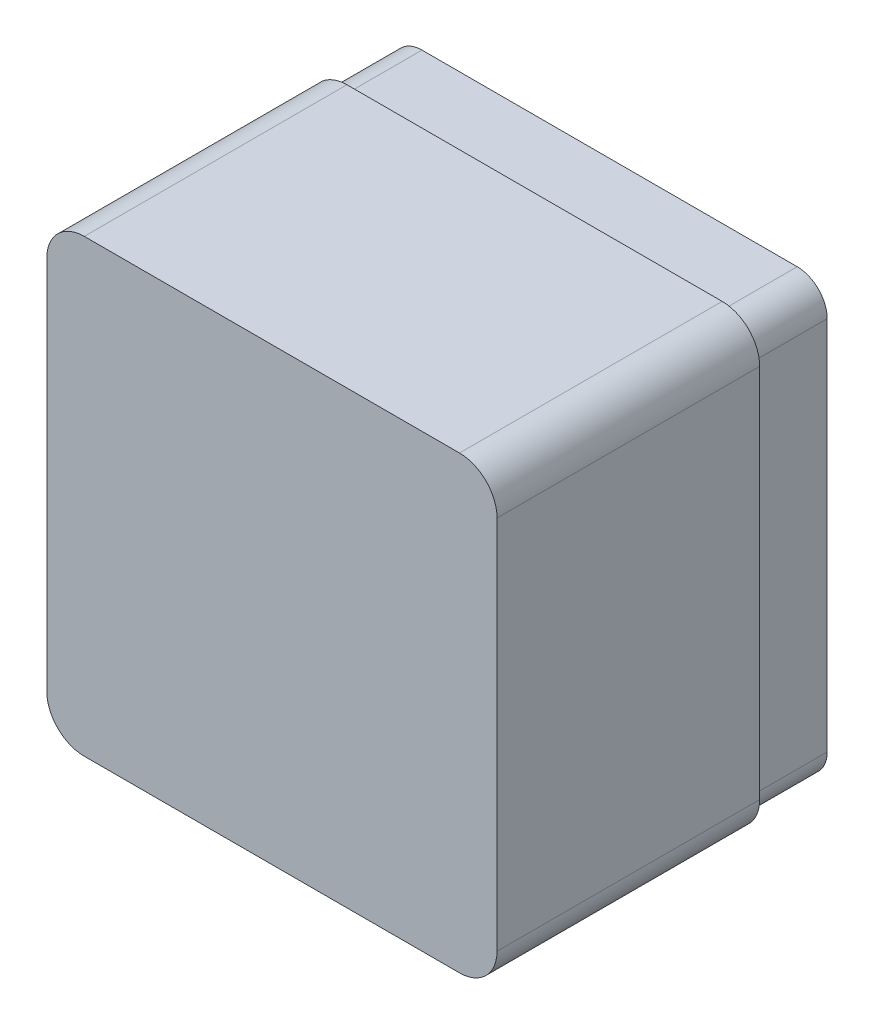
ISO-10303-21;
HEADER;
FILE_DESCRIPTION(('STEP AP214'),'2;1');
FILE_NAME('part.step','',(''),(''),'','','');
FILE_SCHEMA(('AUTOMOTIVE_DESIGN { 1 0 10303 214 1 1 1 1 }'));
ENDSEC;
DATA;
#1=APPLICATION_CONTEXT('core data for automotive mechanical design processes');
#2=APPLICATION_PROTOCOL_DEFINITION('international standard','automotive_design',2000,#1);
#3=PRODUCT_CONTEXT('',#1,'mechanical');
#4=PRODUCT('Part','Part','',(#3));
#5=PRODUCT_RELATED_PRODUCT_CATEGORY('part','',(#4));
#6=PRODUCT_DEFINITION_FORMATION('','',#4);
#7=PRODUCT_DEFINITION_CONTEXT('part definition',#1,'design');
#8=PRODUCT_DEFINITION('design','',#6,#7);
#9=PRODUCT_DEFINITION_SHAPE('','',#8);
#10=(LENGTH_UNIT() NAMED_UNIT(*) SI_UNIT(.MILLI.,.METRE.));
#11=(NAMED_UNIT(*) PLANE_ANGLE_UNIT() SI_UNIT($,.RADIAN.));
#12=(NAMED_UNIT(*) SI_UNIT($,.STERADIAN.) SOLID_ANGLE_UNIT());
#13=UNCERTAINTY_MEASURE_WITH_UNIT(LENGTH_MEASURE(1.E-05),#10,'distance_accuracy_value','');
#14=(GEOMETRIC_REPRESENTATION_CONTEXT(3) GLOBAL_UNCERTAINTY_ASSIGNED_CONTEXT((#13)) GLOBAL_UNIT_ASSIGNED_CONTEXT((#10,
#11,#12)) REPRESENTATION_CONTEXT('',''));
#15=CARTESIAN_POINT('',(0.,0.,0.));
#16=DIRECTION('',(0.,0.,1.));
#17=DIRECTION('',(1.,0.,0.));
#18=AXIS2_PLACEMENT_3D('',#15,#16,#17);
#19=CARTESIAN_POINT('',(0.,0.,0.));
#20=DIRECTION('',(0.,0.,1.));
#21=DIRECTION('',(1.,0.,0.));
#22=AXIS2_PLACEMENT_3D('',#19,#20,#21);
#23=PLANE('',#22);
#24=CARTESIAN_POINT('',(-50.,-50.,0.));
#25=DIRECTION('',(0.,0.,1.));
#26=DIRECTION('',(1.,0.,0.));
#27=AXIS2_PLACEMENT_3D('',#24,#25,#26);
#28=CIRCLE('',#27,6.);
#29=CARTESIAN_POINT('',(-50.,-56.,0.));
#30=VERTEX_POINT('',#29);
#31=CARTESIAN_POINT('',(-56.,-50.,0.));
#32=VERTEX_POINT('',#31);
#33=EDGE_CURVE('E335',#30,#32,#28,.F.);
#34=ORIENTED_EDGE('',*,*,#33,.F.);
#35=DIRECTION('',(1.,0.,0.));
#36=VECTOR('',#35,1.);
#37=CARTESIAN_POINT('',(-60.,-56.,0.));
#38=LINE('',#37,#36);
#39=CARTESIAN_POINT('',(50.,-56.,0.));
#40=VERTEX_POINT('',#39);
#41=EDGE_CURVE('E382',#30,#40,#38,.T.);
#42=ORIENTED_EDGE('',*,*,#41,.T.);
#43=CARTESIAN_POINT('',(50.,-50.,0.));
#44=DIRECTION('',(0.,0.,1.));
#45=DIRECTION('',(1.,0.,0.));
#46=AXIS2_PLACEMENT_3D('',#43,#44,#45);
#47=CIRCLE('',#46,6.);
#48=CARTESIAN_POINT('',(56.,-50.,0.));
#49=VERTEX_POINT('',#48);
#50=EDGE_CURVE('E392',#49,#40,#47,.F.);
#51=ORIENTED_EDGE('',*,*,#50,.F.);
#52=DIRECTION('',(0.,1.,0.));
#53=VECTOR('',#52,1.);
#54=CARTESIAN_POINT('',(56.,60.,0.));
#55=LINE('',#54,#53);
#56=CARTESIAN_POINT('',(56.,50.,0.));
#57=VERTEX_POINT('',#56);
#58=EDGE_CURVE('E389',#49,#57,#55,.T.);
#59=ORIENTED_EDGE('',*,*,#58,.T.);
#60=CARTESIAN_POINT('',(50.,50.,0.));
#61=DIRECTION('',(0.,0.,1.));
#62=DIRECTION('',(1.,0.,0.));
#63=AXIS2_PLACEMENT_3D('',#60,#61,#62);
#64=CIRCLE('',#63,6.);
#65=CARTESIAN_POINT('',(50.,56.,0.));
#66=VERTEX_POINT('',#65);
#67=EDGE_CURVE('E385',#66,#57,#64,.F.);
#68=ORIENTED_EDGE('',*,*,#67,.F.);
#69=DIRECTION('',(-1.,0.,0.));
#70=VECTOR('',#69,1.);
#71=CARTESIAN_POINT('',(-60.,56.,0.));
#72=LINE('',#71,#70);
#73=CARTESIAN_POINT('',(-50.,56.,0.));
#74=VERTEX_POINT('',#73);
#75=EDGE_CURVE('E332',#66,#74,#72,.T.);
#76=ORIENTED_EDGE('',*,*,#75,.T.);
#77=CARTESIAN_POINT('',(-50.,50.,0.));
#78=DIRECTION('',(0.,0.,1.));
#79=DIRECTION('',(1.,0.,0.));
#80=AXIS2_PLACEMENT_3D('',#77,#78,#79);
#81=CIRCLE('',#80,6.);
#82=CARTESIAN_POINT('',(-56.,50.,0.));
#83=VERTEX_POINT('',#82);
#84=EDGE_CURVE('E363',#83,#74,#81,.F.);
#85=ORIENTED_EDGE('',*,*,#84,.F.);
#86=DIRECTION('',(0.,-1.,0.));
#87=VECTOR('',#86,1.);
#88=CARTESIAN_POINT('',(-56.,60.,0.));
#89=LINE('',#88,#87);
#90=EDGE_CURVE('E321',#83,#32,#89,.T.);
#91=ORIENTED_EDGE('',*,*,#90,.T.);
#92=EDGE_LOOP('',(#34,#42,#51,#59,#68,#76,#85,#91));
#93=FACE_BOUND('',#92,.T.);
#94=CARTESIAN_POINT('',(-50.,50.,0.));
#95=DIRECTION('',(0.,0.,-1.));
#96=DIRECTION('',(-1.,0.,0.));
#97=AXIS2_PLACEMENT_3D('',#94,#95,#96);
#98=CIRCLE('',#97,7.99999999999999);
#99=CARTESIAN_POINT('',(-58.,50.,0.));
#100=VERTEX_POINT('',#99);
#101=CARTESIAN_POINT('',(-50.,58.,0.));
#102=VERTEX_POINT('',#101);
#103=EDGE_CURVE('E257',#100,#102,#98,.T.);
#104=ORIENTED_EDGE('',*,*,#103,.T.);
#105=DIRECTION('',(1.,0.,0.));
#106=VECTOR('',#105,1.);
#107=CARTESIAN_POINT('',(-50.,58.,0.));
#108=LINE('',#107,#106);
#109=CARTESIAN_POINT('',(50.,58.,0.));
#110=VERTEX_POINT('',#109);
#111=EDGE_CURVE('E207',#102,#110,#108,.T.);
#112=ORIENTED_EDGE('',*,*,#111,.T.);
#113=CARTESIAN_POINT('',(50.,50.,0.));
#114=DIRECTION('',(0.,0.,-1.));
#115=DIRECTION('',(-1.,0.,0.));
#116=AXIS2_PLACEMENT_3D('',#113,#114,#115);
#117=CIRCLE('',#116,7.99999999999999);
#118=CARTESIAN_POINT('',(58.,50.,0.));
#119=VERTEX_POINT('',#118);
#120=EDGE_CURVE('E55',#110,#119,#117,.T.);
#121=ORIENTED_EDGE('',*,*,#120,.T.);
#122=DIRECTION('',(0.,-1.,0.));
#123=VECTOR('',#122,1.);
#124=CARTESIAN_POINT('',(58.,50.,0.));
#125=LINE('',#124,#123);
#126=CARTESIAN_POINT('',(58.,-50.,0.));
#127=VERTEX_POINT('',#126);
#128=EDGE_CURVE('E264',#119,#127,#125,.T.);
#129=ORIENTED_EDGE('',*,*,#128,.T.);
#130=CARTESIAN_POINT('',(50.,-50.,0.));
#131=DIRECTION('',(0.,0.,-1.));
#132=DIRECTION('',(-1.,0.,0.));
#133=AXIS2_PLACEMENT_3D('',#130,#131,#132);
#134=CIRCLE('',#133,7.99999999999999);
#135=CARTESIAN_POINT('',(50.,-58.,0.));
#136=VERTEX_POINT('',#135);
#137=EDGE_CURVE('E268',#127,#136,#134,.T.);
#138=ORIENTED_EDGE('',*,*,#137,.T.);
#139=DIRECTION('',(-1.,0.,0.));
#140=VECTOR('',#139,1.);
#141=CARTESIAN_POINT('',(50.,-58.,0.));
#142=LINE('',#141,#140);
#143=CARTESIAN_POINT('',(-50.,-58.,0.));
#144=VERTEX_POINT('',#143);
#145=EDGE_CURVE('E272',#136,#144,#142,.T.);
#146=ORIENTED_EDGE('',*,*,#145,.T.);
#147=CARTESIAN_POINT('',(-50.,-50.,0.));
#148=DIRECTION('',(0.,0.,-1.));
#149=DIRECTION('',(-1.,0.,0.));
#150=AXIS2_PLACEMENT_3D('',#147,#148,#149);
#151=CIRCLE('',#150,7.99999999999999);
#152=CARTESIAN_POINT('',(-58.,-50.,0.));
#153=VERTEX_POINT('',#152);
#154=EDGE_CURVE('E234',#144,#153,#151,.T.);
#155=ORIENTED_EDGE('',*,*,#154,.T.);
#156=DIRECTION('',(0.,1.,0.));
#157=VECTOR('',#156,1.);
#158=CARTESIAN_POINT('',(-58.,-50.,0.));
#159=LINE('',#158,#157);
#160=EDGE_CURVE('E230',#153,#100,#159,.T.);
#161=ORIENTED_EDGE('',*,*,#160,.T.);
#162=EDGE_LOOP('',(#104,#112,#121,#129,#138,#146,#155,#161));
#163=FACE_BOUND('',#162,.T.);
#164=ADVANCED_FACE('F39',(#93,#163),#23,.F.);
#165=CARTESIAN_POINT('',(-56.,60.,90.));
#166=DIRECTION('',(1.,0.,0.));
#167=DIRECTION('',(0.,0.,-1.));
#168=AXIS2_PLACEMENT_3D('',#165,#166,#167);
#169=PLANE('',#168);
#170=ORIENTED_EDGE('',*,*,#90,.F.);
#171=DIRECTION('',(0.,0.,-1.));
#172=VECTOR('',#171,1.);
#173=CARTESIAN_POINT('',(-56.,50.,90.));
#174=LINE('',#173,#172);
#175=CARTESIAN_POINT('',(-56.,50.,86.));
#176=VERTEX_POINT('',#175);
#177=EDGE_CURVE('E326',#176,#83,#174,.T.);
#178=ORIENTED_EDGE('',*,*,#177,.F.);
#179=DIRECTION('',(0.,-1.,0.));
#180=VECTOR('',#179,1.);
#181=CARTESIAN_POINT('',(-56.,60.,86.));
#182=LINE('',#181,#180);
#183=CARTESIAN_POINT('',(-56.,-50.,86.));
#184=VERTEX_POINT('',#183);
#185=EDGE_CURVE('E327',#176,#184,#182,.T.);
#186=ORIENTED_EDGE('',*,*,#185,.T.);
#187=DIRECTION('',(0.,0.,-1.));
#188=VECTOR('',#187,1.);
#189=CARTESIAN_POINT('',(-56.,-50.,90.));
#190=LINE('',#189,#188);
#191=EDGE_CURVE('E322',#32,#184,#190,.F.);
#192=ORIENTED_EDGE('',*,*,#191,.F.);
#193=EDGE_LOOP('',(#170,#178,#186,#192));
#194=FACE_BOUND('',#193,.T.);
#195=ADVANCED_FACE('F504',(#194),#169,.T.);
#196=CARTESIAN_POINT('',(-60.,-56.,90.));
#197=DIRECTION('',(0.,1.,0.));
#198=DIRECTION('',(0.,0.,1.));
#199=AXIS2_PLACEMENT_3D('',#196,#197,#198);
#200=PLANE('',#199);
#201=DIRECTION('',(1.,0.,0.));
#202=VECTOR('',#201,1.);
#203=CARTESIAN_POINT('',(-60.,-56.,86.));
#204=LINE('',#203,#202);
#205=CARTESIAN_POINT('',(-50.,-56.,86.));
#206=VERTEX_POINT('',#205);
#207=CARTESIAN_POINT('',(50.,-56.,86.));
#208=VERTEX_POINT('',#207);
#209=EDGE_CURVE('E331',#206,#208,#204,.T.);
#210=ORIENTED_EDGE('',*,*,#209,.T.);
#211=DIRECTION('',(0.,0.,1.));
#212=VECTOR('',#211,1.);
#213=CARTESIAN_POINT('',(50.,-56.,90.));
#214=LINE('',#213,#212);
#215=EDGE_CURVE('E357',#40,#208,#214,.T.);
#216=ORIENTED_EDGE('',*,*,#215,.F.);
#217=ORIENTED_EDGE('',*,*,#41,.F.);
#218=DIRECTION('',(0.,0.,1.));
#219=VECTOR('',#218,1.);
#220=CARTESIAN_POINT('',(-50.,-56.,90.));
#221=LINE('',#220,#219);
#222=EDGE_CURVE('E360',#206,#30,#221,.F.);
#223=ORIENTED_EDGE('',*,*,#222,.F.);
#224=EDGE_LOOP('',(#210,#216,#217,#223));
#225=FACE_BOUND('',#224,.T.);
#226=ADVANCED_FACE('F510',(#225),#200,.T.);
#227=CARTESIAN_POINT('',(56.,60.,90.));
#228=DIRECTION('',(-1.,0.,0.));
#229=DIRECTION('',(0.,0.,1.));
#230=AXIS2_PLACEMENT_3D('',#227,#228,#229);
#231=PLANE('',#230);
#232=DIRECTION('',(0.,1.,0.));
#233=VECTOR('',#232,1.);
#234=CARTESIAN_POINT('',(56.,60.,86.));
#235=LINE('',#234,#233);
#236=CARTESIAN_POINT('',(56.,-50.,86.));
#237=VERTEX_POINT('',#236);
#238=CARTESIAN_POINT('',(56.,50.,86.));
#239=VERTEX_POINT('',#238);
#240=EDGE_CURVE('E344',#237,#239,#235,.T.);
#241=ORIENTED_EDGE('',*,*,#240,.T.);
#242=DIRECTION('',(0.,0.,1.));
#243=VECTOR('',#242,1.);
#244=CARTESIAN_POINT('',(56.,50.,90.));
#245=LINE('',#244,#243);
#246=EDGE_CURVE('E339',#57,#239,#245,.T.);
#247=ORIENTED_EDGE('',*,*,#246,.F.);
#248=ORIENTED_EDGE('',*,*,#58,.F.);
#249=DIRECTION('',(0.,0.,1.));
#250=VECTOR('',#249,1.);
#251=CARTESIAN_POINT('',(56.,-50.,90.));
#252=LINE('',#251,#250);
#253=EDGE_CURVE('E366',#237,#49,#252,.F.);
#254=ORIENTED_EDGE('',*,*,#253,.F.);
#255=EDGE_LOOP('',(#241,#247,#248,#254));
#256=FACE_BOUND('',#255,.T.);
#257=ADVANCED_FACE('F694',(#256),#231,.T.);
#258=CARTESIAN_POINT('',(-60.,56.,90.));
#259=DIRECTION('',(0.,-1.,0.));
#260=DIRECTION('',(0.,0.,-1.));
#261=AXIS2_PLACEMENT_3D('',#258,#259,#260);
#262=PLANE('',#261);
#263=DIRECTION('',(-1.,0.,0.));
#264=VECTOR('',#263,1.);
#265=CARTESIAN_POINT('',(-60.,56.,86.));
#266=LINE('',#265,#264);
#267=CARTESIAN_POINT('',(50.,56.,86.));
#268=VERTEX_POINT('',#267);
#269=CARTESIAN_POINT('',(-50.,56.,86.));
#270=VERTEX_POINT('',#269);
#271=EDGE_CURVE('E351',#268,#270,#266,.T.);
#272=ORIENTED_EDGE('',*,*,#271,.T.);
#273=DIRECTION('',(0.,0.,-1.));
#274=VECTOR('',#273,1.);
#275=CARTESIAN_POINT('',(-50.,56.,90.));
#276=LINE('',#275,#274);
#277=EDGE_CURVE('E370',#74,#270,#276,.F.);
#278=ORIENTED_EDGE('',*,*,#277,.F.);
#279=ORIENTED_EDGE('',*,*,#75,.F.);
#280=DIRECTION('',(0.,0.,-1.));
#281=VECTOR('',#280,1.);
#282=CARTESIAN_POINT('',(50.,56.,90.));
#283=LINE('',#282,#281);
#284=EDGE_CURVE('E373',#268,#66,#283,.T.);
#285=ORIENTED_EDGE('',*,*,#284,.F.);
#286=EDGE_LOOP('',(#272,#278,#279,#285));
#287=FACE_BOUND('',#286,.T.);
#288=ADVANCED_FACE('F685',(#287),#262,.T.);
#289=CARTESIAN_POINT('',(0.,0.,86.));
#290=DIRECTION('',(0.,0.,1.));
#291=DIRECTION('',(1.,0.,0.));
#292=AXIS2_PLACEMENT_3D('',#289,#290,#291);
#293=PLANE('',#292);
#294=ORIENTED_EDGE('',*,*,#185,.F.);
#295=CARTESIAN_POINT('',(-50.,50.,86.));
#296=DIRECTION('',(0.,0.,1.));
#297=DIRECTION('',(1.,0.,0.));
#298=AXIS2_PLACEMENT_3D('',#295,#296,#297);
#299=CIRCLE('',#298,6.);
#300=EDGE_CURVE('E325',#270,#176,#299,.T.);
#301=ORIENTED_EDGE('',*,*,#300,.F.);
#302=ORIENTED_EDGE('',*,*,#271,.F.);
#303=CARTESIAN_POINT('',(50.,50.,86.));
#304=DIRECTION('',(0.,0.,1.));
#305=DIRECTION('',(1.,0.,0.));
#306=AXIS2_PLACEMENT_3D('',#303,#304,#305);
#307=CIRCLE('',#306,6.);
#308=EDGE_CURVE('E347',#239,#268,#307,.T.);
#309=ORIENTED_EDGE('',*,*,#308,.F.);
#310=ORIENTED_EDGE('',*,*,#240,.F.);
#311=CARTESIAN_POINT('',(50.,-50.,86.));
#312=DIRECTION('',(0.,0.,1.));
#313=DIRECTION('',(1.,0.,0.));
#314=AXIS2_PLACEMENT_3D('',#311,#312,#313);
#315=CIRCLE('',#314,6.);
#316=EDGE_CURVE('E340',#208,#237,#315,.T.);
#317=ORIENTED_EDGE('',*,*,#316,.F.);
#318=ORIENTED_EDGE('',*,*,#209,.F.);
#319=CARTESIAN_POINT('',(-50.,-50.,86.));
#320=DIRECTION('',(0.,0.,1.));
#321=DIRECTION('',(1.,0.,0.));
#322=AXIS2_PLACEMENT_3D('',#319,#320,#321);
#323=CIRCLE('',#322,6.);
#324=EDGE_CURVE('E336',#184,#206,#323,.T.);
#325=ORIENTED_EDGE('',*,*,#324,.F.);
#326=EDGE_LOOP('',(#294,#301,#302,#309,#310,#317,#318,#325));
#327=FACE_BOUND('',#326,.T.);
#328=ADVANCED_FACE('F676',(#327),#293,.F.);
#329=CARTESIAN_POINT('',(-50.,-50.,90.));
#330=DIRECTION('',(0.,0.,-1.));
#331=DIRECTION('',(-1.,0.,0.));
#332=AXIS2_PLACEMENT_3D('',#329,#330,#331);
#333=CYLINDRICAL_SURFACE('',#332,6.);
#334=ORIENTED_EDGE('',*,*,#324,.T.);
#335=ORIENTED_EDGE('',*,*,#222,.T.);
#336=ORIENTED_EDGE('',*,*,#33,.T.);
#337=ORIENTED_EDGE('',*,*,#191,.T.);
#338=EDGE_LOOP('',(#334,#335,#336,#337));
#339=FACE_BOUND('',#338,.T.);
#340=ADVANCED_FACE('F667',(#339),#333,.F.);
#341=CARTESIAN_POINT('',(50.,-50.,90.));
#342=DIRECTION('',(0.,0.,-1.));
#343=DIRECTION('',(-1.,0.,0.));
#344=AXIS2_PLACEMENT_3D('',#341,#342,#343);
#345=CYLINDRICAL_SURFACE('',#344,6.);
#346=ORIENTED_EDGE('',*,*,#316,.T.);
#347=ORIENTED_EDGE('',*,*,#253,.T.);
#348=ORIENTED_EDGE('',*,*,#50,.T.);
#349=ORIENTED_EDGE('',*,*,#215,.T.);
#350=EDGE_LOOP('',(#346,#347,#348,#349));
#351=FACE_BOUND('',#350,.T.);
#352=ADVANCED_FACE('F658',(#351),#345,.F.);
#353=CARTESIAN_POINT('',(50.,50.,90.));
#354=DIRECTION('',(0.,0.,-1.));
#355=DIRECTION('',(-1.,0.,0.));
#356=AXIS2_PLACEMENT_3D('',#353,#354,#355);
#357=CYLINDRICAL_SURFACE('',#356,6.);
#358=ORIENTED_EDGE('',*,*,#308,.T.);
#359=ORIENTED_EDGE('',*,*,#284,.T.);
#360=ORIENTED_EDGE('',*,*,#67,.T.);
#361=ORIENTED_EDGE('',*,*,#246,.T.);
#362=EDGE_LOOP('',(#358,#359,#360,#361));
#363=FACE_BOUND('',#362,.T.);
#364=ADVANCED_FACE('F499',(#363),#357,.F.);
#365=CARTESIAN_POINT('',(-50.,50.,90.));
#366=DIRECTION('',(0.,0.,-1.));
#367=DIRECTION('',(-1.,0.,0.));
#368=AXIS2_PLACEMENT_3D('',#365,#366,#367);
#369=CYLINDRICAL_SURFACE('',#368,6.);
#370=ORIENTED_EDGE('',*,*,#300,.T.);
#371=ORIENTED_EDGE('',*,*,#177,.T.);
#372=ORIENTED_EDGE('',*,*,#84,.T.);
#373=ORIENTED_EDGE('',*,*,#277,.T.);
#374=EDGE_LOOP('',(#370,#371,#372,#373));
#375=FACE_BOUND('',#374,.T.);
#376=ADVANCED_FACE('F491',(#375),#369,.F.);
#377=CARTESIAN_POINT('',(50.,-50.,20.));
#378=DIRECTION('',(0.,0.,-1.));
#379=DIRECTION('',(-1.,0.,0.));
#380=AXIS2_PLACEMENT_3D('',#377,#378,#379);
#381=PLANE('',#380);
#382=DIRECTION('',(0.,1.,0.));
#383=VECTOR('',#382,1.);
#384=CARTESIAN_POINT('',(-58.,-50.,20.));
#385=LINE('',#384,#383);
#386=CARTESIAN_POINT('',(-58.,-50.,20.));
#387=VERTEX_POINT('',#386);
#388=CARTESIAN_POINT('',(-58.,50.,20.));
#389=VERTEX_POINT('',#388);
#390=EDGE_CURVE('E214',#387,#389,#385,.T.);
#391=ORIENTED_EDGE('',*,*,#390,.F.);
#392=CARTESIAN_POINT('',(-50.,-50.,20.));
#393=DIRECTION('',(0.,0.,-1.));
#394=DIRECTION('',(-1.,0.,0.));
#395=AXIS2_PLACEMENT_3D('',#392,#393,#394);
#396=CIRCLE('',#395,7.99999999999999);
#397=CARTESIAN_POINT('',(-50.,-58.,20.));
#398=VERTEX_POINT('',#397);
#399=EDGE_CURVE('E251',#398,#387,#396,.T.);
#400=ORIENTED_EDGE('',*,*,#399,.F.);
#401=DIRECTION('',(-1.,0.,0.));
#402=VECTOR('',#401,1.);
#403=CARTESIAN_POINT('',(50.,-58.,20.));
#404=LINE('',#403,#402);
#405=CARTESIAN_POINT('',(50.,-58.,20.));
#406=VERTEX_POINT('',#405);
#407=EDGE_CURVE('E247',#406,#398,#404,.T.);
#408=ORIENTED_EDGE('',*,*,#407,.F.);
#409=CARTESIAN_POINT('',(50.,-50.,20.));
#410=DIRECTION('',(0.,0.,-1.));
#411=DIRECTION('',(-1.,0.,0.));
#412=AXIS2_PLACEMENT_3D('',#409,#410,#411);
#413=CIRCLE('',#412,7.99999999999999);
#414=CARTESIAN_POINT('',(58.,-50.,20.));
#415=VERTEX_POINT('',#414);
#416=EDGE_CURVE('E243',#415,#406,#413,.T.);
#417=ORIENTED_EDGE('',*,*,#416,.F.);
#418=DIRECTION('',(0.,-1.,0.));
#419=VECTOR('',#418,1.);
#420=CARTESIAN_POINT('',(58.,50.,20.));
#421=LINE('',#420,#419);
#422=CARTESIAN_POINT('',(58.,50.,20.));
#423=VERTEX_POINT('',#422);
#424=EDGE_CURVE('E239',#423,#415,#421,.T.);
#425=ORIENTED_EDGE('',*,*,#424,.F.);
#426=CARTESIAN_POINT('',(50.,50.,20.));
#427=DIRECTION('',(0.,0.,-1.));
#428=DIRECTION('',(-1.,0.,0.));
#429=AXIS2_PLACEMENT_3D('',#426,#427,#428);
#430=CIRCLE('',#429,7.99999999999999);
#431=CARTESIAN_POINT('',(50.,58.,20.));
#432=VERTEX_POINT('',#431);
#433=EDGE_CURVE('E224',#432,#423,#430,.T.);
#434=ORIENTED_EDGE('',*,*,#433,.F.);
#435=DIRECTION('',(1.,0.,0.));
#436=VECTOR('',#435,1.);
#437=CARTESIAN_POINT('',(-50.,58.,20.));
#438=LINE('',#437,#436);
#439=CARTESIAN_POINT('',(-50.,58.,20.));
#440=VERTEX_POINT('',#439);
#441=EDGE_CURVE('E205',#440,#432,#438,.T.);
#442=ORIENTED_EDGE('',*,*,#441,.F.);
#443=CARTESIAN_POINT('',(-50.,50.,20.));
#444=DIRECTION('',(0.,0.,-1.));
#445=DIRECTION('',(-1.,0.,0.));
#446=AXIS2_PLACEMENT_3D('',#443,#444,#445);
#447=CIRCLE('',#446,7.99999999999999);
#448=EDGE_CURVE('E220',#389,#440,#447,.T.);
#449=ORIENTED_EDGE('',*,*,#448,.F.);
#450=EDGE_LOOP('',(#391,#400,#408,#417,#425,#434,#442,#449));
#451=FACE_BOUND('',#450,.T.);
#452=CARTESIAN_POINT('',(50.,-50.,20.));
#453=DIRECTION('',(0.,0.,-1.));
#454=DIRECTION('',(-1.,0.,0.));
#455=AXIS2_PLACEMENT_3D('',#452,#453,#454);
#456=CIRCLE('',#455,9.99999999999999);
#457=CARTESIAN_POINT('',(60.,-50.,20.));
#458=VERTEX_POINT('',#457);
#459=CARTESIAN_POINT('',(50.,-60.,20.));
#460=VERTEX_POINT('',#459);
#461=EDGE_CURVE('E281',#458,#460,#456,.T.);
#462=ORIENTED_EDGE('',*,*,#461,.T.);
#463=DIRECTION('',(-1.,0.,0.));
#464=VECTOR('',#463,1.);
#465=CARTESIAN_POINT('',(50.,-60.,20.));
#466=LINE('',#465,#464);
#467=CARTESIAN_POINT('',(-50.,-60.,20.));
#468=VERTEX_POINT('',#467);
#469=EDGE_CURVE('E301',#460,#468,#466,.T.);
#470=ORIENTED_EDGE('',*,*,#469,.T.);
#471=CARTESIAN_POINT('',(-50.,-50.,20.));
#472=DIRECTION('',(0.,0.,-1.));
#473=DIRECTION('',(-1.,0.,0.));
#474=AXIS2_PLACEMENT_3D('',#471,#472,#473);
#475=CIRCLE('',#474,9.99999999999999);
#476=CARTESIAN_POINT('',(-60.,-50.,20.));
#477=VERTEX_POINT('',#476);
#478=EDGE_CURVE('E304',#468,#477,#475,.T.);
#479=ORIENTED_EDGE('',*,*,#478,.T.);
#480=DIRECTION('',(0.,1.,0.));
#481=VECTOR('',#480,1.);
#482=CARTESIAN_POINT('',(-60.,-50.,20.));
#483=LINE('',#482,#481);
#484=CARTESIAN_POINT('',(-60.,50.,20.));
#485=VERTEX_POINT('',#484);
#486=EDGE_CURVE('E63',#477,#485,#483,.T.);
#487=ORIENTED_EDGE('',*,*,#486,.T.);
#488=CARTESIAN_POINT('',(-50.,50.,20.));
#489=DIRECTION('',(0.,0.,-1.));
#490=DIRECTION('',(-1.,0.,0.));
#491=AXIS2_PLACEMENT_3D('',#488,#489,#490);
#492=CIRCLE('',#491,9.99999999999999);
#493=CARTESIAN_POINT('',(-50.,60.,20.));
#494=VERTEX_POINT('',#493);
#495=EDGE_CURVE('E309',#485,#494,#492,.T.);
#496=ORIENTED_EDGE('',*,*,#495,.T.);
#497=DIRECTION('',(1.,0.,0.));
#498=VECTOR('',#497,1.);
#499=CARTESIAN_POINT('',(-50.,60.,20.));
#500=LINE('',#499,#498);
#501=CARTESIAN_POINT('',(50.,60.,20.));
#502=VERTEX_POINT('',#501);
#503=EDGE_CURVE('E312',#494,#502,#500,.T.);
#504=ORIENTED_EDGE('',*,*,#503,.T.);
#505=CARTESIAN_POINT('',(50.,50.,20.));
#506=DIRECTION('',(0.,0.,-1.));
#507=DIRECTION('',(-1.,0.,0.));
#508=AXIS2_PLACEMENT_3D('',#505,#506,#507);
#509=CIRCLE('',#508,9.99999999999999);
#510=CARTESIAN_POINT('',(60.,50.,20.));
#511=VERTEX_POINT('',#510);
#512=EDGE_CURVE('E315',#502,#511,#509,.T.);
#513=ORIENTED_EDGE('',*,*,#512,.T.);
#514=DIRECTION('',(0.,-1.,0.));
#515=VECTOR('',#514,1.);
#516=CARTESIAN_POINT('',(60.,50.,20.));
#517=LINE('',#516,#515);
#518=EDGE_CURVE('E318',#511,#458,#517,.T.);
#519=ORIENTED_EDGE('',*,*,#518,.T.);
#520=EDGE_LOOP('',(#462,#470,#479,#487,#496,#504,#513,#519));
#521=FACE_BOUND('',#520,.T.);
#522=ADVANCED_FACE('F219',(#451,#521),#381,.T.);
#523=CARTESIAN_POINT('',(-50.,50.,20.));
#524=DIRECTION('',(0.,0.,-1.));
#525=DIRECTION('',(-1.,0.,0.));
#526=AXIS2_PLACEMENT_3D('',#523,#524,#525);
#527=CYLINDRICAL_SURFACE('',#526,7.99999999999999);
#528=ORIENTED_EDGE('',*,*,#103,.F.);
#529=DIRECTION('',(0.,0.,-1.));
#530=VECTOR('',#529,1.);
#531=CARTESIAN_POINT('',(-58.,50.,20.));
#532=LINE('',#531,#530);
#533=EDGE_CURVE('E228',#389,#100,#532,.T.);
#534=ORIENTED_EDGE('',*,*,#533,.F.);
#535=ORIENTED_EDGE('',*,*,#448,.T.);
#536=DIRECTION('',(0.,0.,-1.));
#537=VECTOR('',#536,1.);
#538=CARTESIAN_POINT('',(-50.,58.,20.));
#539=LINE('',#538,#537);
#540=EDGE_CURVE('E202',#440,#102,#539,.T.);
#541=ORIENTED_EDGE('',*,*,#540,.T.);
#542=EDGE_LOOP('',(#528,#534,#535,#541));
#543=FACE_BOUND('',#542,.T.);
#544=ADVANCED_FACE('F227',(#543),#527,.T.);
#545=CARTESIAN_POINT('',(-58.,-50.,20.));
#546=DIRECTION('',(-1.,0.,0.));
#547=DIRECTION('',(0.,0.,1.));
#548=AXIS2_PLACEMENT_3D('',#545,#546,#547);
#549=PLANE('',#548);
#550=ORIENTED_EDGE('',*,*,#160,.F.);
#551=DIRECTION('',(0.,0.,-1.));
#552=VECTOR('',#551,1.);
#553=CARTESIAN_POINT('',(-58.,-50.,20.));
#554=LINE('',#553,#552);
#555=EDGE_CURVE('E282',#387,#153,#554,.T.);
#556=ORIENTED_EDGE('',*,*,#555,.F.);
#557=ORIENTED_EDGE('',*,*,#390,.T.);
#558=ORIENTED_EDGE('',*,*,#533,.T.);
#559=EDGE_LOOP('',(#550,#556,#557,#558));
#560=FACE_BOUND('',#559,.T.);
#561=ADVANCED_FACE('F497',(#560),#549,.T.);
#562=CARTESIAN_POINT('',(-50.,-50.,20.));
#563=DIRECTION('',(0.,0.,-1.));
#564=DIRECTION('',(-1.,0.,0.));
#565=AXIS2_PLACEMENT_3D('',#562,#563,#564);
#566=CYLINDRICAL_SURFACE('',#565,7.99999999999999);
#567=ORIENTED_EDGE('',*,*,#154,.F.);
#568=DIRECTION('',(0.,0.,-1.));
#569=VECTOR('',#568,1.);
#570=CARTESIAN_POINT('',(-50.,-58.,20.));
#571=LINE('',#570,#569);
#572=EDGE_CURVE('E285',#398,#144,#571,.T.);
#573=ORIENTED_EDGE('',*,*,#572,.F.);
#574=ORIENTED_EDGE('',*,*,#399,.T.);
#575=ORIENTED_EDGE('',*,*,#555,.T.);
#576=EDGE_LOOP('',(#567,#573,#574,#575));
#577=FACE_BOUND('',#576,.T.);
#578=ADVANCED_FACE('F575',(#577),#566,.T.);
#579=CARTESIAN_POINT('',(50.,-58.,20.));
#580=DIRECTION('',(0.,-1.,0.));
#581=DIRECTION('',(0.,0.,-1.));
#582=AXIS2_PLACEMENT_3D('',#579,#580,#581);
#583=PLANE('',#582);
#584=ORIENTED_EDGE('',*,*,#145,.F.);
#585=DIRECTION('',(0.,0.,-1.));
#586=VECTOR('',#585,1.);
#587=CARTESIAN_POINT('',(50.,-58.,20.));
#588=LINE('',#587,#586);
#589=EDGE_CURVE('E288',#406,#136,#588,.T.);
#590=ORIENTED_EDGE('',*,*,#589,.F.);
#591=ORIENTED_EDGE('',*,*,#407,.T.);
#592=ORIENTED_EDGE('',*,*,#572,.T.);
#593=EDGE_LOOP('',(#584,#590,#591,#592));
#594=FACE_BOUND('',#593,.T.);
#595=ADVANCED_FACE('F584',(#594),#583,.T.);
#596=CARTESIAN_POINT('',(50.,-50.,20.));
#597=DIRECTION('',(0.,0.,-1.));
#598=DIRECTION('',(-1.,0.,0.));
#599=AXIS2_PLACEMENT_3D('',#596,#597,#598);
#600=CYLINDRICAL_SURFACE('',#599,7.99999999999999);
#601=ORIENTED_EDGE('',*,*,#137,.F.);
#602=DIRECTION('',(0.,0.,-1.));
#603=VECTOR('',#602,1.);
#604=CARTESIAN_POINT('',(58.,-50.,20.));
#605=LINE('',#604,#603);
#606=EDGE_CURVE('E291',#415,#127,#605,.T.);
#607=ORIENTED_EDGE('',*,*,#606,.F.);
#608=ORIENTED_EDGE('',*,*,#416,.T.);
#609=ORIENTED_EDGE('',*,*,#589,.T.);
#610=EDGE_LOOP('',(#601,#607,#608,#609));
#611=FACE_BOUND('',#610,.T.);
#612=ADVANCED_FACE('F593',(#611),#600,.T.);
#613=CARTESIAN_POINT('',(58.,50.,20.));
#614=DIRECTION('',(1.,0.,0.));
#615=DIRECTION('',(0.,0.,-1.));
#616=AXIS2_PLACEMENT_3D('',#613,#614,#615);
#617=PLANE('',#616);
#618=ORIENTED_EDGE('',*,*,#128,.F.);
#619=DIRECTION('',(0.,0.,-1.));
#620=VECTOR('',#619,1.);
#621=CARTESIAN_POINT('',(58.,50.,20.));
#622=LINE('',#621,#620);
#623=EDGE_CURVE('E294',#423,#119,#622,.T.);
#624=ORIENTED_EDGE('',*,*,#623,.F.);
#625=ORIENTED_EDGE('',*,*,#424,.T.);
#626=ORIENTED_EDGE('',*,*,#606,.T.);
#627=EDGE_LOOP('',(#618,#624,#625,#626));
#628=FACE_BOUND('',#627,.T.);
#629=ADVANCED_FACE('F602',(#628),#617,.T.);
#630=CARTESIAN_POINT('',(50.,50.,20.));
#631=DIRECTION('',(0.,0.,-1.));
#632=DIRECTION('',(-1.,0.,0.));
#633=AXIS2_PLACEMENT_3D('',#630,#631,#632);
#634=CYLINDRICAL_SURFACE('',#633,7.99999999999999);
#635=ORIENTED_EDGE('',*,*,#120,.F.);
#636=DIRECTION('',(0.,0.,-1.));
#637=VECTOR('',#636,1.);
#638=CARTESIAN_POINT('',(50.,58.,20.));
#639=LINE('',#638,#637);
#640=EDGE_CURVE('E213',#432,#110,#639,.T.);
#641=ORIENTED_EDGE('',*,*,#640,.F.);
#642=ORIENTED_EDGE('',*,*,#433,.T.);
#643=ORIENTED_EDGE('',*,*,#623,.T.);
#644=EDGE_LOOP('',(#635,#641,#642,#643));
#645=FACE_BOUND('',#644,.T.);
#646=ADVANCED_FACE('F611',(#645),#634,.T.);
#647=CARTESIAN_POINT('',(-50.,58.,20.));
#648=DIRECTION('',(0.,1.,0.));
#649=DIRECTION('',(0.,0.,1.));
#650=AXIS2_PLACEMENT_3D('',#647,#648,#649);
#651=PLANE('',#650);
#652=ORIENTED_EDGE('',*,*,#111,.F.);
#653=ORIENTED_EDGE('',*,*,#540,.F.);
#654=ORIENTED_EDGE('',*,*,#441,.T.);
#655=ORIENTED_EDGE('',*,*,#640,.T.);
#656=EDGE_LOOP('',(#652,#653,#654,#655));
#657=FACE_BOUND('',#656,.T.);
#658=ADVANCED_FACE('F204',(#657),#651,.T.);
#659=CARTESIAN_POINT('',(0.,0.,90.));
#660=DIRECTION('',(0.,0.,1.));
#661=DIRECTION('',(1.,0.,0.));
#662=AXIS2_PLACEMENT_3D('',#659,#660,#661);
#663=PLANE('',#662);
#664=DIRECTION('',(0.,-1.,0.));
#665=VECTOR('',#664,1.);
#666=CARTESIAN_POINT('',(-60.,60.,90.));
#667=LINE('',#666,#665);
#668=CARTESIAN_POINT('',(-60.,50.,90.));
#669=VERTEX_POINT('',#668);
#670=CARTESIAN_POINT('',(-60.,-50.,90.));
#671=VERTEX_POINT('',#670);
#672=EDGE_CURVE('E376',#669,#671,#667,.T.);
#673=ORIENTED_EDGE('',*,*,#672,.T.);
#674=CARTESIAN_POINT('',(-50.,-50.,90.));
#675=DIRECTION('',(0.,0.,1.));
#676=DIRECTION('',(1.,0.,0.));
#677=AXIS2_PLACEMENT_3D('',#674,#675,#676);
#678=CIRCLE('',#677,10.);
#679=CARTESIAN_POINT('',(-50.,-60.,90.));
#680=VERTEX_POINT('',#679);
#681=EDGE_CURVE('E441',#671,#680,#678,.T.);
#682=ORIENTED_EDGE('',*,*,#681,.T.);
#683=DIRECTION('',(1.,0.,0.));
#684=VECTOR('',#683,1.);
#685=CARTESIAN_POINT('',(-60.,-60.,90.));
#686=LINE('',#685,#684);
#687=CARTESIAN_POINT('',(50.,-60.,90.));
#688=VERTEX_POINT('',#687);
#689=EDGE_CURVE('E406',#680,#688,#686,.T.);
#690=ORIENTED_EDGE('',*,*,#689,.T.);
#691=CARTESIAN_POINT('',(50.,-50.,90.));
#692=DIRECTION('',(0.,0.,1.));
#693=DIRECTION('',(1.,0.,0.));
#694=AXIS2_PLACEMENT_3D('',#691,#692,#693);
#695=CIRCLE('',#694,10.);
#696=CARTESIAN_POINT('',(60.,-50.,90.));
#697=VERTEX_POINT('',#696);
#698=EDGE_CURVE('E438',#688,#697,#695,.T.);
#699=ORIENTED_EDGE('',*,*,#698,.T.);
#700=DIRECTION('',(0.,1.,0.));
#701=VECTOR('',#700,1.);
#702=CARTESIAN_POINT('',(60.,60.,90.));
#703=LINE('',#702,#701);
#704=CARTESIAN_POINT('',(60.,50.,90.));
#705=VERTEX_POINT('',#704);
#706=EDGE_CURVE('E410',#697,#705,#703,.T.);
#707=ORIENTED_EDGE('',*,*,#706,.T.);
#708=CARTESIAN_POINT('',(50.,50.,90.));
#709=DIRECTION('',(0.,0.,1.));
#710=DIRECTION('',(1.,0.,0.));
#711=AXIS2_PLACEMENT_3D('',#708,#709,#710);
#712=CIRCLE('',#711,10.);
#713=CARTESIAN_POINT('',(50.,60.,90.));
#714=VERTEX_POINT('',#713);
#715=EDGE_CURVE('E435',#705,#714,#712,.T.);
#716=ORIENTED_EDGE('',*,*,#715,.T.);
#717=DIRECTION('',(-1.,0.,0.));
#718=VECTOR('',#717,1.);
#719=CARTESIAN_POINT('',(-60.,60.,90.));
#720=LINE('',#719,#718);
#721=CARTESIAN_POINT('',(-50.,60.,90.));
#722=VERTEX_POINT('',#721);
#723=EDGE_CURVE('E414',#714,#722,#720,.T.);
#724=ORIENTED_EDGE('',*,*,#723,.T.);
#725=CARTESIAN_POINT('',(-50.,50.,90.));
#726=DIRECTION('',(0.,0.,1.));
#727=DIRECTION('',(1.,0.,0.));
#728=AXIS2_PLACEMENT_3D('',#725,#726,#727);
#729=CIRCLE('',#728,10.);
#730=EDGE_CURVE('E432',#722,#669,#729,.T.);
#731=ORIENTED_EDGE('',*,*,#730,.T.);
#732=EDGE_LOOP('',(#673,#682,#690,#699,#707,#716,#724,#731));
#733=FACE_BOUND('',#732,.T.);
#734=ADVANCED_FACE('F460',(#733),#663,.T.);
#735=CARTESIAN_POINT('',(-50.,-50.,90.));
#736=DIRECTION('',(0.,0.,-1.));
#737=DIRECTION('',(-1.,0.,0.));
#738=AXIS2_PLACEMENT_3D('',#735,#736,#737);
#739=CYLINDRICAL_SURFACE('',#738,10.);
#740=DIRECTION('',(0.,0.,-1.));
#741=VECTOR('',#740,1.);
#742=CARTESIAN_POINT('',(-60.,-50.,90.));
#743=LINE('',#742,#741);
#744=EDGE_CURVE('E429',#477,#671,#743,.F.);
#745=ORIENTED_EDGE('',*,*,#744,.F.);
#746=ORIENTED_EDGE('',*,*,#478,.F.);
#747=DIRECTION('',(0.,0.,-1.));
#748=VECTOR('',#747,1.);
#749=CARTESIAN_POINT('',(-50.,-60.,90.));
#750=LINE('',#749,#748);
#751=EDGE_CURVE('E421',#680,#468,#750,.T.);
#752=ORIENTED_EDGE('',*,*,#751,.F.);
#753=ORIENTED_EDGE('',*,*,#681,.F.);
#754=EDGE_LOOP('',(#745,#746,#752,#753));
#755=FACE_BOUND('',#754,.T.);
#756=ADVANCED_FACE('F471',(#755),#739,.T.);
#757=CARTESIAN_POINT('',(50.,-50.,90.));
#758=DIRECTION('',(0.,0.,-1.));
#759=DIRECTION('',(-1.,0.,0.));
#760=AXIS2_PLACEMENT_3D('',#757,#758,#759);
#761=CYLINDRICAL_SURFACE('',#760,10.);
#762=DIRECTION('',(0.,0.,-1.));
#763=VECTOR('',#762,1.);
#764=CARTESIAN_POINT('',(50.,-60.,90.));
#765=LINE('',#764,#763);
#766=EDGE_CURVE('E418',#460,#688,#765,.F.);
#767=ORIENTED_EDGE('',*,*,#766,.F.);
#768=ORIENTED_EDGE('',*,*,#461,.F.);
#769=DIRECTION('',(0.,0.,-1.));
#770=VECTOR('',#769,1.);
#771=CARTESIAN_POINT('',(60.,-50.,90.));
#772=LINE('',#771,#770);
#773=EDGE_CURVE('E447',#697,#458,#772,.T.);
#774=ORIENTED_EDGE('',*,*,#773,.F.);
#775=ORIENTED_EDGE('',*,*,#698,.F.);
#776=EDGE_LOOP('',(#767,#768,#774,#775));
#777=FACE_BOUND('',#776,.T.);
#778=ADVANCED_FACE('F481',(#777),#761,.T.);
#779=CARTESIAN_POINT('',(50.,50.,90.));
#780=DIRECTION('',(0.,0.,-1.));
#781=DIRECTION('',(-1.,0.,0.));
#782=AXIS2_PLACEMENT_3D('',#779,#780,#781);
#783=CYLINDRICAL_SURFACE('',#782,10.);
#784=DIRECTION('',(0.,0.,-1.));
#785=VECTOR('',#784,1.);
#786=CARTESIAN_POINT('',(60.,50.,90.));
#787=LINE('',#786,#785);
#788=EDGE_CURVE('E444',#511,#705,#787,.F.);
#789=ORIENTED_EDGE('',*,*,#788,.F.);
#790=ORIENTED_EDGE('',*,*,#512,.F.);
#791=DIRECTION('',(0.,0.,-1.));
#792=VECTOR('',#791,1.);
#793=CARTESIAN_POINT('',(50.,60.,90.));
#794=LINE('',#793,#792);
#795=EDGE_CURVE('E11',#714,#502,#794,.T.);
#796=ORIENTED_EDGE('',*,*,#795,.F.);
#797=ORIENTED_EDGE('',*,*,#715,.F.);
#798=EDGE_LOOP('',(#789,#790,#796,#797));
#799=FACE_BOUND('',#798,.T.);
#800=ADVANCED_FACE('F488',(#799),#783,.T.);
#801=CARTESIAN_POINT('',(-50.,50.,90.));
#802=DIRECTION('',(0.,0.,-1.));
#803=DIRECTION('',(-1.,0.,0.));
#804=AXIS2_PLACEMENT_3D('',#801,#802,#803);
#805=CYLINDRICAL_SURFACE('',#804,10.);
#806=DIRECTION('',(0.,0.,-1.));
#807=VECTOR('',#806,1.);
#808=CARTESIAN_POINT('',(-50.,60.,90.));
#809=LINE('',#808,#807);
#810=EDGE_CURVE('E48',#494,#722,#809,.F.);
#811=ORIENTED_EDGE('',*,*,#810,.F.);
#812=ORIENTED_EDGE('',*,*,#495,.F.);
#813=DIRECTION('',(0.,0.,-1.));
#814=VECTOR('',#813,1.);
#815=CARTESIAN_POINT('',(-60.,50.,90.));
#816=LINE('',#815,#814);
#817=EDGE_CURVE('E425',#669,#485,#816,.T.);
#818=ORIENTED_EDGE('',*,*,#817,.F.);
#819=ORIENTED_EDGE('',*,*,#730,.F.);
#820=EDGE_LOOP('',(#811,#812,#818,#819));
#821=FACE_BOUND('',#820,.T.);
#822=ADVANCED_FACE('F41',(#821),#805,.T.);
#823=CARTESIAN_POINT('',(-60.,60.,90.));
#824=DIRECTION('',(0.,-1.,0.));
#825=DIRECTION('',(0.,0.,-1.));
#826=AXIS2_PLACEMENT_3D('',#823,#824,#825);
#827=PLANE('',#826);
#828=ORIENTED_EDGE('',*,*,#503,.F.);
#829=ORIENTED_EDGE('',*,*,#810,.T.);
#830=ORIENTED_EDGE('',*,*,#723,.F.);
#831=ORIENTED_EDGE('',*,*,#795,.T.);
#832=EDGE_LOOP('',(#828,#829,#830,#831));
#833=FACE_BOUND('',#832,.T.);
#834=ADVANCED_FACE('F455',(#833),#827,.F.);
#835=CARTESIAN_POINT('',(60.,60.,90.));
#836=DIRECTION('',(-1.,0.,0.));
#837=DIRECTION('',(0.,0.,1.));
#838=AXIS2_PLACEMENT_3D('',#835,#836,#837);
#839=PLANE('',#838);
#840=ORIENTED_EDGE('',*,*,#518,.F.);
#841=ORIENTED_EDGE('',*,*,#788,.T.);
#842=ORIENTED_EDGE('',*,*,#706,.F.);
#843=ORIENTED_EDGE('',*,*,#773,.T.);
#844=EDGE_LOOP('',(#840,#841,#842,#843));
#845=FACE_BOUND('',#844,.T.);
#846=ADVANCED_FACE('F485',(#845),#839,.F.);
#847=CARTESIAN_POINT('',(-60.,-60.,90.));
#848=DIRECTION('',(0.,1.,0.));
#849=DIRECTION('',(0.,0.,1.));
#850=AXIS2_PLACEMENT_3D('',#847,#848,#849);
#851=PLANE('',#850);
#852=ORIENTED_EDGE('',*,*,#469,.F.);
#853=ORIENTED_EDGE('',*,*,#766,.T.);
#854=ORIENTED_EDGE('',*,*,#689,.F.);
#855=ORIENTED_EDGE('',*,*,#751,.T.);
#856=EDGE_LOOP('',(#852,#853,#854,#855));
#857=FACE_BOUND('',#856,.T.);
#858=ADVANCED_FACE('F475',(#857),#851,.F.);
#859=CARTESIAN_POINT('',(-60.,60.,90.));
#860=DIRECTION('',(1.,0.,0.));
#861=DIRECTION('',(0.,0.,-1.));
#862=AXIS2_PLACEMENT_3D('',#859,#860,#861);
#863=PLANE('',#862);
#864=ORIENTED_EDGE('',*,*,#486,.F.);
#865=ORIENTED_EDGE('',*,*,#744,.T.);
#866=ORIENTED_EDGE('',*,*,#672,.F.);
#867=ORIENTED_EDGE('',*,*,#817,.T.);
#868=EDGE_LOOP('',(#864,#865,#866,#867));
#869=FACE_BOUND('',#868,.T.);
#870=ADVANCED_FACE('F465',(#869),#863,.F.);
#871=CLOSED_SHELL('',(#164,#195,#226,#257,#288,#328,#340,#352,#364,#376,#522,#544,#561,#578,
#595,#612,#629,#646,#658,#734,#756,#778,#800,#822,#834,#846,#858,#870));
#872=MANIFOLD_SOLID_BREP('B2',#871);
#873=ADVANCED_BREP_SHAPE_REPRESENTATION('',(#18,#872),#14);
#874=SHAPE_DEFINITION_REPRESENTATION(#9,#873);
ENDSEC;
END-ISO-10303-21;
